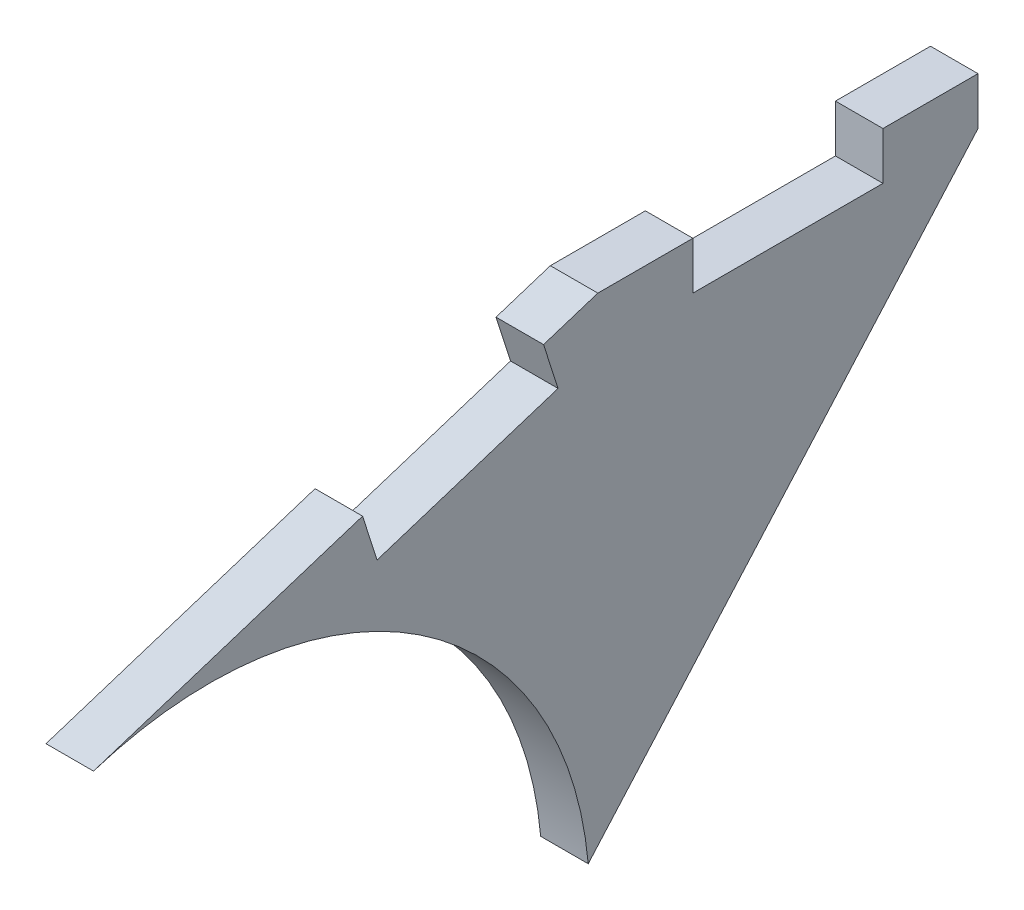
ISO-10303-21;
HEADER;
FILE_DESCRIPTION(('STEP AP214'),'2;1');
FILE_NAME('part.step','',(''),(''),'','','');
FILE_SCHEMA(('AUTOMOTIVE_DESIGN { 1 0 10303 214 1 1 1 1 }'));
ENDSEC;
DATA;
#1=APPLICATION_CONTEXT('core data for automotive mechanical design processes');
#2=APPLICATION_PROTOCOL_DEFINITION('international standard','automotive_design',2000,#1);
#3=PRODUCT_CONTEXT('',#1,'mechanical');
#4=PRODUCT('Part','Part','',(#3));
#5=PRODUCT_RELATED_PRODUCT_CATEGORY('part','',(#4));
#6=PRODUCT_DEFINITION_FORMATION('','',#4);
#7=PRODUCT_DEFINITION_CONTEXT('part definition',#1,'design');
#8=PRODUCT_DEFINITION('design','',#6,#7);
#9=PRODUCT_DEFINITION_SHAPE('','',#8);
#10=(LENGTH_UNIT() NAMED_UNIT(*) SI_UNIT(.MILLI.,.METRE.));
#11=(NAMED_UNIT(*) PLANE_ANGLE_UNIT() SI_UNIT($,.RADIAN.));
#12=(NAMED_UNIT(*) SI_UNIT($,.STERADIAN.) SOLID_ANGLE_UNIT());
#13=UNCERTAINTY_MEASURE_WITH_UNIT(LENGTH_MEASURE(1.E-05),#10,'distance_accuracy_value','');
#14=(GEOMETRIC_REPRESENTATION_CONTEXT(3) GLOBAL_UNCERTAINTY_ASSIGNED_CONTEXT((#13)) GLOBAL_UNIT_ASSIGNED_CONTEXT((#10,
#11,#12)) REPRESENTATION_CONTEXT('',''));
#15=CARTESIAN_POINT('',(0.,0.,0.));
#16=DIRECTION('',(0.,0.,1.));
#17=DIRECTION('',(1.,0.,0.));
#18=AXIS2_PLACEMENT_3D('',#15,#16,#17);
#19=CARTESIAN_POINT('',(1.5875,-18.2499000000001,32.0675));
#20=DIRECTION('',(-1.,0.,0.));
#21=DIRECTION('',(0.,0.,1.));
#22=AXIS2_PLACEMENT_3D('',#19,#20,#21);
#23=CYLINDRICAL_SURFACE('',#22,12.7);
#24=CARTESIAN_POINT('',(0.,-18.2499000000001,32.0675));
#25=DIRECTION('',(1.,0.,0.));
#26=DIRECTION('',(0.,0.,-1.));
#27=AXIS2_PLACEMENT_3D('',#24,#25,#26);
#28=CIRCLE('',#27,12.7);
#29=CARTESIAN_POINT('',(0.,-17.1021532740688,19.4194694239335));
#30=VERTEX_POINT('',#29);
#31=CARTESIAN_POINT('',(0.,-6.15691438401747,35.9468941397643));
#32=VERTEX_POINT('',#31);
#33=EDGE_CURVE('E159',#30,#32,#28,.T.);
#34=ORIENTED_EDGE('',*,*,#33,.F.);
#35=DIRECTION('',(-1.,0.,0.));
#36=VECTOR('',#35,1.);
#37=CARTESIAN_POINT('',(1.5875,-17.1021532740688,19.4194694239335));
#38=LINE('',#37,#36);
#39=CARTESIAN_POINT('',(1.5875,-17.1021532740688,19.4194694239335));
#40=VERTEX_POINT('',#39);
#41=EDGE_CURVE('E11',#40,#30,#38,.T.);
#42=ORIENTED_EDGE('',*,*,#41,.F.);
#43=CARTESIAN_POINT('',(1.5875,-18.2499000000001,32.0675));
#44=DIRECTION('',(1.,0.,0.));
#45=DIRECTION('',(0.,0.,-1.));
#46=AXIS2_PLACEMENT_3D('',#43,#44,#45);
#47=CIRCLE('',#46,12.7);
#48=CARTESIAN_POINT('',(1.5875,-6.15691438401747,35.9468941397643));
#49=VERTEX_POINT('',#48);
#50=EDGE_CURVE('E186',#40,#49,#47,.T.);
#51=ORIENTED_EDGE('',*,*,#50,.T.);
#52=DIRECTION('',(-1.,0.,0.));
#53=VECTOR('',#52,1.);
#54=CARTESIAN_POINT('',(1.5875,-6.15691438401747,35.9468941397643));
#55=LINE('',#54,#53);
#56=EDGE_CURVE('E103',#49,#32,#55,.T.);
#57=ORIENTED_EDGE('',*,*,#56,.T.);
#58=EDGE_LOOP('',(#34,#42,#51,#57));
#59=FACE_BOUND('',#58,.T.);
#60=ADVANCED_FACE('F37',(#59),#23,.F.);
#61=CARTESIAN_POINT('',(1.5875,2.15034053650592,2.43790342218396));
#62=DIRECTION('',(0.,-0.661491781048184,-0.74995241422753));
#63=DIRECTION('',(0.,0.74995241422753,-0.661491781048184));
#64=AXIS2_PLACEMENT_3D('',#61,#62,#63);
#65=PLANE('',#64);
#66=DIRECTION('',(0.,-0.74995241422753,0.661491781048184));
#67=VECTOR('',#66,1.);
#68=CARTESIAN_POINT('',(0.,2.15034053650592,2.43790342218396));
#69=LINE('',#68,#67);
#70=CARTESIAN_POINT('',(0.,-2.33933999999986,6.39800371399999));
#71=VERTEX_POINT('',#70);
#72=EDGE_CURVE('E162',#71,#30,#69,.T.);
#73=ORIENTED_EDGE('',*,*,#72,.F.);
#74=DIRECTION('',(-1.,0.,0.));
#75=VECTOR('',#74,1.);
#76=CARTESIAN_POINT('',(1.5875,-2.33933999999986,6.39800371399999));
#77=LINE('',#76,#75);
#78=CARTESIAN_POINT('',(1.5875,-2.33933999999986,6.39800371399999));
#79=VERTEX_POINT('',#78);
#80=EDGE_CURVE('E45',#79,#71,#77,.T.);
#81=ORIENTED_EDGE('',*,*,#80,.F.);
#82=DIRECTION('',(0.,-0.74995241422753,0.661491781048184));
#83=VECTOR('',#82,1.);
#84=CARTESIAN_POINT('',(1.5875,2.15034053650592,2.43790342218396));
#85=LINE('',#84,#83);
#86=EDGE_CURVE('E260',#79,#40,#85,.T.);
#87=ORIENTED_EDGE('',*,*,#86,.T.);
#88=ORIENTED_EDGE('',*,*,#41,.T.);
#89=EDGE_LOOP('',(#73,#81,#87,#88));
#90=FACE_BOUND('',#89,.T.);
#91=ADVANCED_FACE('F219',(#90),#65,.T.);
#92=CARTESIAN_POINT('',(1.5875,0.,6.39800371399999));
#93=DIRECTION('',(0.,0.,-1.));
#94=DIRECTION('',(0.,1.,0.));
#95=AXIS2_PLACEMENT_3D('',#92,#93,#94);
#96=PLANE('',#95);
#97=DIRECTION('',(0.,-1.,0.));
#98=VECTOR('',#97,1.);
#99=CARTESIAN_POINT('',(0.,0.,6.39800371399999));
#100=LINE('',#99,#98);
#101=CARTESIAN_POINT('',(0.,-0.751839999999862,6.39800371399999));
#102=VERTEX_POINT('',#101);
#103=EDGE_CURVE('E165',#102,#71,#100,.T.);
#104=ORIENTED_EDGE('',*,*,#103,.F.);
#105=DIRECTION('',(-1.,0.,0.));
#106=VECTOR('',#105,1.);
#107=CARTESIAN_POINT('',(1.5875,-0.751839999999862,6.39800371399999));
#108=LINE('',#107,#106);
#109=CARTESIAN_POINT('',(1.5875,-0.751839999999862,6.39800371399999));
#110=VERTEX_POINT('',#109);
#111=EDGE_CURVE('E208',#110,#102,#108,.T.);
#112=ORIENTED_EDGE('',*,*,#111,.F.);
#113=DIRECTION('',(0.,-1.,0.));
#114=VECTOR('',#113,1.);
#115=CARTESIAN_POINT('',(1.5875,0.,6.39800371399999));
#116=LINE('',#115,#114);
#117=EDGE_CURVE('E215',#110,#79,#116,.T.);
#118=ORIENTED_EDGE('',*,*,#117,.T.);
#119=ORIENTED_EDGE('',*,*,#80,.T.);
#120=EDGE_LOOP('',(#104,#112,#118,#119));
#121=FACE_BOUND('',#120,.T.);
#122=ADVANCED_FACE('F213',(#121),#96,.T.);
#123=CARTESIAN_POINT('',(1.5875,-0.751839999999859,0.));
#124=DIRECTION('',(0.,-1.,0.));
#125=DIRECTION('',(0.,0.,-1.));
#126=AXIS2_PLACEMENT_3D('',#123,#124,#125);
#127=PLANE('',#126);
#128=DIRECTION('',(0.,0.,1.));
#129=VECTOR('',#128,1.);
#130=CARTESIAN_POINT('',(0.,-0.751839999999859,0.));
#131=LINE('',#130,#129);
#132=CARTESIAN_POINT('',(0.,-0.751839999999863,9.57300371399999));
#133=VERTEX_POINT('',#132);
#134=EDGE_CURVE('E168',#102,#133,#131,.T.);
#135=ORIENTED_EDGE('',*,*,#134,.T.);
#136=DIRECTION('',(-1.,0.,0.));
#137=VECTOR('',#136,1.);
#138=CARTESIAN_POINT('',(1.5875,-0.751839999999863,9.57300371399999));
#139=LINE('',#138,#137);
#140=CARTESIAN_POINT('',(1.5875,-0.751839999999863,9.57300371399999));
#141=VERTEX_POINT('',#140);
#142=EDGE_CURVE('E205',#141,#133,#139,.T.);
#143=ORIENTED_EDGE('',*,*,#142,.F.);
#144=DIRECTION('',(0.,0.,1.));
#145=VECTOR('',#144,1.);
#146=CARTESIAN_POINT('',(1.5875,-0.751839999999859,0.));
#147=LINE('',#146,#145);
#148=EDGE_CURVE('E236',#110,#141,#147,.T.);
#149=ORIENTED_EDGE('',*,*,#148,.F.);
#150=ORIENTED_EDGE('',*,*,#111,.T.);
#151=EDGE_LOOP('',(#135,#143,#149,#150));
#152=FACE_BOUND('',#151,.T.);
#153=ADVANCED_FACE('F227',(#152),#127,.F.);
#154=CARTESIAN_POINT('',(1.5875,0.,9.57300371399999));
#155=DIRECTION('',(0.,0.,-1.));
#156=DIRECTION('',(-1.,0.,0.));
#157=AXIS2_PLACEMENT_3D('',#154,#155,#156);
#158=PLANE('',#157);
#159=DIRECTION('',(0.,-1.,0.));
#160=VECTOR('',#159,1.);
#161=CARTESIAN_POINT('',(0.,0.,9.57300371399999));
#162=LINE('',#161,#160);
#163=CARTESIAN_POINT('',(0.,-2.33933999999986,9.57300371399999));
#164=VERTEX_POINT('',#163);
#165=EDGE_CURVE('E170',#133,#164,#162,.T.);
#166=ORIENTED_EDGE('',*,*,#165,.T.);
#167=DIRECTION('',(-1.,0.,0.));
#168=VECTOR('',#167,1.);
#169=CARTESIAN_POINT('',(1.5875,-2.33933999999986,9.57300371399999));
#170=LINE('',#169,#168);
#171=CARTESIAN_POINT('',(1.5875,-2.33933999999986,9.57300371399999));
#172=VERTEX_POINT('',#171);
#173=EDGE_CURVE('E202',#172,#164,#170,.T.);
#174=ORIENTED_EDGE('',*,*,#173,.F.);
#175=DIRECTION('',(0.,-1.,0.));
#176=VECTOR('',#175,1.);
#177=CARTESIAN_POINT('',(1.5875,0.,9.57300371399999));
#178=LINE('',#177,#176);
#179=EDGE_CURVE('E233',#141,#172,#178,.T.);
#180=ORIENTED_EDGE('',*,*,#179,.F.);
#181=ORIENTED_EDGE('',*,*,#142,.T.);
#182=EDGE_LOOP('',(#166,#174,#180,#181));
#183=FACE_BOUND('',#182,.T.);
#184=ADVANCED_FACE('F231',(#183),#158,.F.);
#185=CARTESIAN_POINT('',(1.5875,-2.33933999999986,0.));
#186=DIRECTION('',(0.,-1.,0.));
#187=DIRECTION('',(0.,0.,-1.));
#188=AXIS2_PLACEMENT_3D('',#185,#186,#187);
#189=PLANE('',#188);
#190=DIRECTION('',(0.,0.,1.));
#191=VECTOR('',#190,1.);
#192=CARTESIAN_POINT('',(0.,-2.33933999999986,0.));
#193=LINE('',#192,#191);
#194=CARTESIAN_POINT('',(0.,-2.33933999999986,15.923003714));
#195=VERTEX_POINT('',#194);
#196=EDGE_CURVE('E172',#164,#195,#193,.T.);
#197=ORIENTED_EDGE('',*,*,#196,.T.);
#198=DIRECTION('',(-1.,0.,0.));
#199=VECTOR('',#198,1.);
#200=CARTESIAN_POINT('',(1.5875,-2.33933999999986,15.923003714));
#201=LINE('',#200,#199);
#202=CARTESIAN_POINT('',(1.5875,-2.33933999999986,15.923003714));
#203=VERTEX_POINT('',#202);
#204=EDGE_CURVE('E199',#203,#195,#201,.T.);
#205=ORIENTED_EDGE('',*,*,#204,.F.);
#206=DIRECTION('',(0.,0.,1.));
#207=VECTOR('',#206,1.);
#208=CARTESIAN_POINT('',(1.5875,-2.33933999999986,0.));
#209=LINE('',#208,#207);
#210=EDGE_CURVE('E235',#172,#203,#209,.T.);
#211=ORIENTED_EDGE('',*,*,#210,.F.);
#212=ORIENTED_EDGE('',*,*,#173,.T.);
#213=EDGE_LOOP('',(#197,#205,#211,#212));
#214=FACE_BOUND('',#213,.T.);
#215=ADVANCED_FACE('F276',(#214),#189,.F.);
#216=CARTESIAN_POINT('',(1.5875,0.,15.923003714));
#217=DIRECTION('',(0.,0.,1.));
#218=DIRECTION('',(1.,0.,0.));
#219=AXIS2_PLACEMENT_3D('',#216,#217,#218);
#220=PLANE('',#219);
#221=DIRECTION('',(0.,1.,0.));
#222=VECTOR('',#221,1.);
#223=CARTESIAN_POINT('',(0.,0.,15.923003714));
#224=LINE('',#223,#222);
#225=CARTESIAN_POINT('',(0.,-0.751839999999863,15.923003714));
#226=VERTEX_POINT('',#225);
#227=EDGE_CURVE('E174',#195,#226,#224,.T.);
#228=ORIENTED_EDGE('',*,*,#227,.T.);
#229=DIRECTION('',(-1.,0.,0.));
#230=VECTOR('',#229,1.);
#231=CARTESIAN_POINT('',(1.5875,-0.751839999999863,15.923003714));
#232=LINE('',#231,#230);
#233=CARTESIAN_POINT('',(1.5875,-0.751839999999863,15.923003714));
#234=VERTEX_POINT('',#233);
#235=EDGE_CURVE('E196',#234,#226,#232,.T.);
#236=ORIENTED_EDGE('',*,*,#235,.F.);
#237=DIRECTION('',(0.,1.,0.));
#238=VECTOR('',#237,1.);
#239=CARTESIAN_POINT('',(1.5875,0.,15.923003714));
#240=LINE('',#239,#238);
#241=EDGE_CURVE('E238',#203,#234,#240,.T.);
#242=ORIENTED_EDGE('',*,*,#241,.F.);
#243=ORIENTED_EDGE('',*,*,#204,.T.);
#244=EDGE_LOOP('',(#228,#236,#242,#243));
#245=FACE_BOUND('',#244,.T.);
#246=ADVANCED_FACE('F279',(#245),#220,.F.);
#247=CARTESIAN_POINT('',(1.5875,-0.75183999999986,0.));
#248=DIRECTION('',(0.,-1.,0.));
#249=DIRECTION('',(0.,0.,-1.));
#250=AXIS2_PLACEMENT_3D('',#247,#248,#249);
#251=PLANE('',#250);
#252=DIRECTION('',(0.,0.,1.));
#253=VECTOR('',#252,1.);
#254=CARTESIAN_POINT('',(0.,-0.75183999999986,0.));
#255=LINE('',#254,#253);
#256=CARTESIAN_POINT('',(0.,-0.751839999999863,19.098003714));
#257=VERTEX_POINT('',#256);
#258=EDGE_CURVE('E176',#226,#257,#255,.T.);
#259=ORIENTED_EDGE('',*,*,#258,.T.);
#260=DIRECTION('',(-1.,0.,0.));
#261=VECTOR('',#260,1.);
#262=CARTESIAN_POINT('',(1.5875,-0.751839999999863,19.098003714));
#263=LINE('',#262,#261);
#264=CARTESIAN_POINT('',(1.5875,-0.751839999999863,19.098003714));
#265=VERTEX_POINT('',#264);
#266=EDGE_CURVE('E193',#265,#257,#263,.T.);
#267=ORIENTED_EDGE('',*,*,#266,.F.);
#268=DIRECTION('',(0.,0.,1.));
#269=VECTOR('',#268,1.);
#270=CARTESIAN_POINT('',(1.5875,-0.75183999999986,0.));
#271=LINE('',#270,#269);
#272=EDGE_CURVE('E244',#234,#265,#271,.T.);
#273=ORIENTED_EDGE('',*,*,#272,.F.);
#274=ORIENTED_EDGE('',*,*,#235,.T.);
#275=EDGE_LOOP('',(#259,#267,#273,#274));
#276=FACE_BOUND('',#275,.T.);
#277=ADVANCED_FACE('F283',(#276),#251,.F.);
#278=CARTESIAN_POINT('',(1.5875,4.8732350311635,1.56331943342461));
#279=DIRECTION('',(0.,-0.952203591809654,-0.305464105493253));
#280=DIRECTION('',(0.,0.305464105493253,-0.952203591809654));
#281=AXIS2_PLACEMENT_3D('',#278,#279,#280);
#282=PLANE('',#281);
#283=DIRECTION('',(0.,-0.305464105493253,0.952203591809654));
#284=VECTOR('',#283,1.);
#285=CARTESIAN_POINT('',(0.,4.8732350311635,1.56331943342461));
#286=LINE('',#285,#284);
#287=CARTESIAN_POINT('',(0.,-1.33374912096451,20.9119515563974));
#288=VERTEX_POINT('',#287);
#289=EDGE_CURVE('E178',#257,#288,#286,.T.);
#290=ORIENTED_EDGE('',*,*,#289,.T.);
#291=DIRECTION('',(-1.,0.,0.));
#292=VECTOR('',#291,1.);
#293=CARTESIAN_POINT('',(1.5875,-1.33374912096451,20.9119515563974));
#294=LINE('',#293,#292);
#295=CARTESIAN_POINT('',(1.5875,-1.33374912096451,20.9119515563974));
#296=VERTEX_POINT('',#295);
#297=EDGE_CURVE('E190',#296,#288,#294,.T.);
#298=ORIENTED_EDGE('',*,*,#297,.F.);
#299=DIRECTION('',(0.,-0.305464105493253,0.952203591809654));
#300=VECTOR('',#299,1.);
#301=CARTESIAN_POINT('',(1.5875,4.8732350311635,1.56331943342461));
#302=LINE('',#301,#300);
#303=EDGE_CURVE('E246',#265,#296,#302,.T.);
#304=ORIENTED_EDGE('',*,*,#303,.F.);
#305=ORIENTED_EDGE('',*,*,#266,.T.);
#306=EDGE_LOOP('',(#290,#298,#304,#305));
#307=FACE_BOUND('',#306,.T.);
#308=ADVANCED_FACE('F252',(#307),#282,.F.);
#309=CARTESIAN_POINT('',(1.5875,-6.20698415212803,19.3486321229728));
#310=DIRECTION('',(0.,0.305464105493254,-0.952203591809654));
#311=DIRECTION('',(0.,0.952203591809654,0.305464105493254));
#312=AXIS2_PLACEMENT_3D('',#309,#310,#311);
#313=PLANE('',#312);
#314=DIRECTION('',(0.,-0.952203591809654,-0.305464105493254));
#315=VECTOR('',#314,1.);
#316=CARTESIAN_POINT('',(0.,-6.20698415212803,19.3486321229728));
#317=LINE('',#316,#315);
#318=CARTESIAN_POINT('',(0.,-2.84537232296234,20.4270272889268));
#319=VERTEX_POINT('',#318);
#320=EDGE_CURVE('E180',#288,#319,#317,.T.);
#321=ORIENTED_EDGE('',*,*,#320,.T.);
#322=DIRECTION('',(-1.,0.,0.));
#323=VECTOR('',#322,1.);
#324=CARTESIAN_POINT('',(1.5875,-2.84537232296234,20.4270272889268));
#325=LINE('',#324,#323);
#326=CARTESIAN_POINT('',(1.5875,-2.84537232296234,20.4270272889268));
#327=VERTEX_POINT('',#326);
#328=EDGE_CURVE('E151',#327,#319,#325,.T.);
#329=ORIENTED_EDGE('',*,*,#328,.F.);
#330=DIRECTION('',(0.,-0.952203591809654,-0.305464105493254));
#331=VECTOR('',#330,1.);
#332=CARTESIAN_POINT('',(1.5875,-6.20698415212803,19.3486321229728));
#333=LINE('',#332,#331);
#334=EDGE_CURVE('E142',#296,#327,#333,.T.);
#335=ORIENTED_EDGE('',*,*,#334,.F.);
#336=ORIENTED_EDGE('',*,*,#297,.T.);
#337=EDGE_LOOP('',(#321,#329,#335,#336));
#338=FACE_BOUND('',#337,.T.);
#339=ADVANCED_FACE('F256',(#338),#313,.F.);
#340=CARTESIAN_POINT('',(1.5875,3.36161182916567,1.07839516595406));
#341=DIRECTION('',(0.,-0.952203591809655,-0.305464105493252));
#342=DIRECTION('',(0.,0.305464105493252,-0.952203591809655));
#343=AXIS2_PLACEMENT_3D('',#340,#341,#342);
#344=PLANE('',#343);
#345=DIRECTION('',(0.,-0.305464105493252,0.952203591809655));
#346=VECTOR('',#345,1.);
#347=CARTESIAN_POINT('',(0.,3.36161182916567,1.07839516595406));
#348=LINE('',#347,#346);
#349=CARTESIAN_POINT('',(0.,-4.78506939284449,26.4735200969181));
#350=VERTEX_POINT('',#349);
#351=EDGE_CURVE('E150',#319,#350,#348,.T.);
#352=ORIENTED_EDGE('',*,*,#351,.T.);
#353=DIRECTION('',(-1.,0.,0.));
#354=VECTOR('',#353,1.);
#355=CARTESIAN_POINT('',(1.5875,-4.78506939284449,26.4735200969181));
#356=LINE('',#355,#354);
#357=CARTESIAN_POINT('',(1.5875,-4.78506939284449,26.4735200969181));
#358=VERTEX_POINT('',#357);
#359=EDGE_CURVE('E147',#358,#350,#356,.T.);
#360=ORIENTED_EDGE('',*,*,#359,.F.);
#361=DIRECTION('',(0.,-0.305464105493252,0.952203591809655));
#362=VECTOR('',#361,1.);
#363=CARTESIAN_POINT('',(1.5875,3.36161182916567,1.07839516595406));
#364=LINE('',#363,#362);
#365=EDGE_CURVE('E136',#327,#358,#364,.T.);
#366=ORIENTED_EDGE('',*,*,#365,.F.);
#367=ORIENTED_EDGE('',*,*,#328,.T.);
#368=EDGE_LOOP('',(#352,#360,#366,#367));
#369=FACE_BOUND('',#368,.T.);
#370=ADVANCED_FACE('F148',(#369),#344,.F.);
#371=CARTESIAN_POINT('',(1.5875,-8.14668122201019,25.3951249309641));
#372=DIRECTION('',(0.,-0.305464105493254,0.952203591809654));
#373=DIRECTION('',(0.,-0.952203591809654,-0.305464105493254));
#374=AXIS2_PLACEMENT_3D('',#371,#372,#373);
#375=PLANE('',#374);
#376=DIRECTION('',(0.,0.952203591809654,0.305464105493254));
#377=VECTOR('',#376,1.);
#378=CARTESIAN_POINT('',(0.,-8.14668122201019,25.3951249309641));
#379=LINE('',#378,#377);
#380=CARTESIAN_POINT('',(0.,-3.27344619084666,26.9584443643887));
#381=VERTEX_POINT('',#380);
#382=EDGE_CURVE('E96',#350,#381,#379,.T.);
#383=ORIENTED_EDGE('',*,*,#382,.T.);
#384=DIRECTION('',(-1.,0.,0.));
#385=VECTOR('',#384,1.);
#386=CARTESIAN_POINT('',(1.5875,-3.27344619084666,26.9584443643887));
#387=LINE('',#386,#385);
#388=CARTESIAN_POINT('',(1.5875,-3.27344619084666,26.9584443643887));
#389=VERTEX_POINT('',#388);
#390=EDGE_CURVE('E152',#389,#381,#387,.T.);
#391=ORIENTED_EDGE('',*,*,#390,.F.);
#392=DIRECTION('',(0.,0.952203591809654,0.305464105493254));
#393=VECTOR('',#392,1.);
#394=CARTESIAN_POINT('',(1.5875,-8.14668122201019,25.3951249309641));
#395=LINE('',#394,#393);
#396=EDGE_CURVE('E140',#358,#389,#395,.T.);
#397=ORIENTED_EDGE('',*,*,#396,.F.);
#398=ORIENTED_EDGE('',*,*,#359,.T.);
#399=EDGE_LOOP('',(#383,#391,#397,#398));
#400=FACE_BOUND('',#399,.T.);
#401=ADVANCED_FACE('F154',(#400),#375,.F.);
#402=CARTESIAN_POINT('',(1.5875,4.87323503116349,1.5633194334246));
#403=DIRECTION('',(0.,-0.952203591809655,-0.305464105493252));
#404=DIRECTION('',(0.,0.305464105493252,-0.952203591809655));
#405=AXIS2_PLACEMENT_3D('',#402,#403,#404);
#406=PLANE('',#405);
#407=DIRECTION('',(0.,-0.305464105493252,0.952203591809655));
#408=VECTOR('',#407,1.);
#409=CARTESIAN_POINT('',(0.,4.87323503116349,1.5633194334246));
#410=LINE('',#409,#408);
#411=EDGE_CURVE('E184',#381,#32,#410,.T.);
#412=ORIENTED_EDGE('',*,*,#411,.T.);
#413=ORIENTED_EDGE('',*,*,#56,.F.);
#414=DIRECTION('',(0.,-0.305464105493252,0.952203591809655));
#415=VECTOR('',#414,1.);
#416=CARTESIAN_POINT('',(1.5875,4.87323503116349,1.5633194334246));
#417=LINE('',#416,#415);
#418=EDGE_CURVE('E53',#389,#49,#417,.T.);
#419=ORIENTED_EDGE('',*,*,#418,.F.);
#420=ORIENTED_EDGE('',*,*,#390,.T.);
#421=EDGE_LOOP('',(#412,#413,#419,#420));
#422=FACE_BOUND('',#421,.T.);
#423=ADVANCED_FACE('F259',(#422),#406,.F.);
#424=CARTESIAN_POINT('',(1.5875,0.,0.));
#425=DIRECTION('',(1.,0.,0.));
#426=DIRECTION('',(0.,0.,-1.));
#427=AXIS2_PLACEMENT_3D('',#424,#425,#426);
#428=PLANE('',#427);
#429=ORIENTED_EDGE('',*,*,#50,.F.);
#430=ORIENTED_EDGE('',*,*,#86,.F.);
#431=ORIENTED_EDGE('',*,*,#117,.F.);
#432=ORIENTED_EDGE('',*,*,#148,.T.);
#433=ORIENTED_EDGE('',*,*,#179,.T.);
#434=ORIENTED_EDGE('',*,*,#210,.T.);
#435=ORIENTED_EDGE('',*,*,#241,.T.);
#436=ORIENTED_EDGE('',*,*,#272,.T.);
#437=ORIENTED_EDGE('',*,*,#303,.T.);
#438=ORIENTED_EDGE('',*,*,#334,.T.);
#439=ORIENTED_EDGE('',*,*,#365,.T.);
#440=ORIENTED_EDGE('',*,*,#396,.T.);
#441=ORIENTED_EDGE('',*,*,#418,.T.);
#442=EDGE_LOOP('',(#429,#430,#431,#432,#433,#434,#435,#436,#437,#438,#439,#440,#441));
#443=FACE_BOUND('',#442,.T.);
#444=ADVANCED_FACE('F138',(#443),#428,.T.);
#445=CARTESIAN_POINT('',(0.,0.,0.));
#446=DIRECTION('',(1.,0.,0.));
#447=DIRECTION('',(0.,0.,-1.));
#448=AXIS2_PLACEMENT_3D('',#445,#446,#447);
#449=PLANE('',#448);
#450=ORIENTED_EDGE('',*,*,#33,.T.);
#451=ORIENTED_EDGE('',*,*,#411,.F.);
#452=ORIENTED_EDGE('',*,*,#382,.F.);
#453=ORIENTED_EDGE('',*,*,#351,.F.);
#454=ORIENTED_EDGE('',*,*,#320,.F.);
#455=ORIENTED_EDGE('',*,*,#289,.F.);
#456=ORIENTED_EDGE('',*,*,#258,.F.);
#457=ORIENTED_EDGE('',*,*,#227,.F.);
#458=ORIENTED_EDGE('',*,*,#196,.F.);
#459=ORIENTED_EDGE('',*,*,#165,.F.);
#460=ORIENTED_EDGE('',*,*,#134,.F.);
#461=ORIENTED_EDGE('',*,*,#103,.T.);
#462=ORIENTED_EDGE('',*,*,#72,.T.);
#463=EDGE_LOOP('',(#450,#451,#452,#453,#454,#455,#456,#457,#458,#459,#460,#461,#462));
#464=FACE_BOUND('',#463,.T.);
#465=ADVANCED_FACE('F222',(#464),#449,.F.);
#466=CLOSED_SHELL('',(#60,#91,#122,#153,#184,#215,#246,#277,#308,#339,#370,#401,#423,#444,#465));
#467=MANIFOLD_SOLID_BREP('B2',#466);
#468=ADVANCED_BREP_SHAPE_REPRESENTATION('',(#18,#467),#14);
#469=SHAPE_DEFINITION_REPRESENTATION(#9,#468);
ENDSEC;
END-ISO-10303-21;
